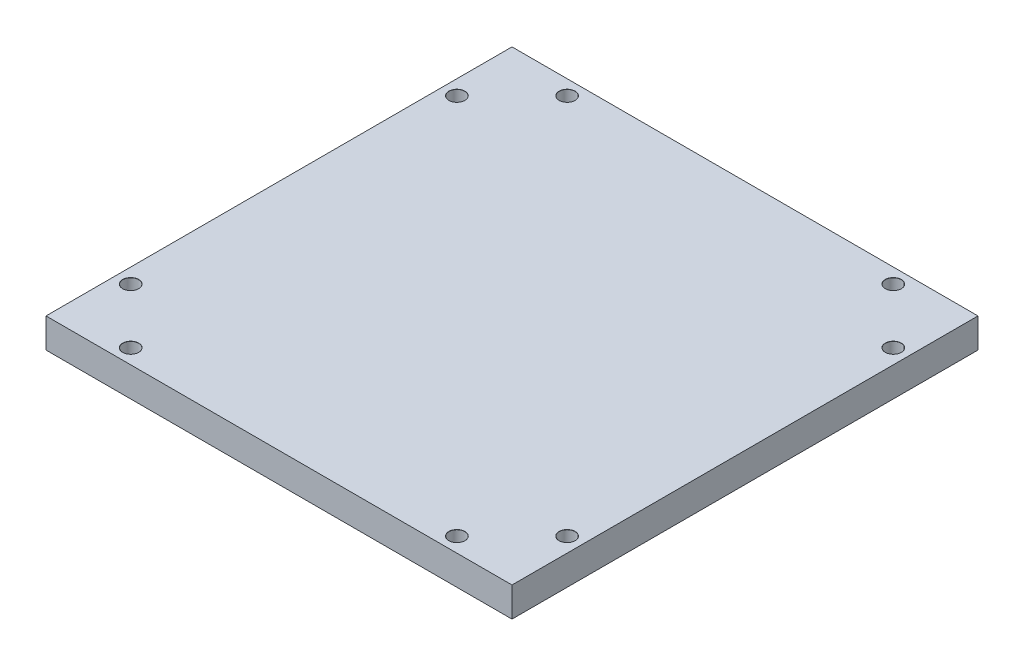
ISO-10303-21;
HEADER;
FILE_DESCRIPTION(('STEP AP214'),'2;1');
FILE_NAME('part.step','',(''),(''),'','','');
FILE_SCHEMA(('AUTOMOTIVE_DESIGN { 1 0 10303 214 1 1 1 1 }'));
ENDSEC;
DATA;
#1=APPLICATION_CONTEXT('core data for automotive mechanical design processes');
#2=APPLICATION_PROTOCOL_DEFINITION('international standard','automotive_design',2000,#1);
#3=PRODUCT_CONTEXT('',#1,'mechanical');
#4=PRODUCT('Part','Part','',(#3));
#5=PRODUCT_RELATED_PRODUCT_CATEGORY('part','',(#4));
#6=PRODUCT_DEFINITION_FORMATION('','',#4);
#7=PRODUCT_DEFINITION_CONTEXT('part definition',#1,'design');
#8=PRODUCT_DEFINITION('design','',#6,#7);
#9=PRODUCT_DEFINITION_SHAPE('','',#8);
#10=(LENGTH_UNIT() NAMED_UNIT(*) SI_UNIT(.MILLI.,.METRE.));
#11=(NAMED_UNIT(*) PLANE_ANGLE_UNIT() SI_UNIT($,.RADIAN.));
#12=(NAMED_UNIT(*) SI_UNIT($,.STERADIAN.) SOLID_ANGLE_UNIT());
#13=UNCERTAINTY_MEASURE_WITH_UNIT(LENGTH_MEASURE(1.E-05),#10,'distance_accuracy_value','');
#14=(GEOMETRIC_REPRESENTATION_CONTEXT(3) GLOBAL_UNCERTAINTY_ASSIGNED_CONTEXT((#13)) GLOBAL_UNIT_ASSIGNED_CONTEXT((#10,
#11,#12)) REPRESENTATION_CONTEXT('',''));
#15=CARTESIAN_POINT('',(0.,0.,0.));
#16=DIRECTION('',(0.,0.,1.));
#17=DIRECTION('',(1.,0.,0.));
#18=AXIS2_PLACEMENT_3D('',#15,#16,#17);
#19=CARTESIAN_POINT('',(0.,6.35,50.));
#20=DIRECTION('',(0.,0.,-1.));
#21=DIRECTION('',(-1.,0.,0.));
#22=AXIS2_PLACEMENT_3D('',#19,#20,#21);
#23=PLANE('',#22);
#24=DIRECTION('',(1.,0.,0.));
#25=VECTOR('',#24,1.);
#26=CARTESIAN_POINT('',(0.,0.,50.));
#27=LINE('',#26,#25);
#28=CARTESIAN_POINT('',(-50.,0.,50.));
#29=VERTEX_POINT('',#28);
#30=CARTESIAN_POINT('',(50.,0.,50.));
#31=VERTEX_POINT('',#30);
#32=EDGE_CURVE('E109',#29,#31,#27,.T.);
#33=ORIENTED_EDGE('',*,*,#32,.T.);
#34=DIRECTION('',(0.,-1.,0.));
#35=VECTOR('',#34,1.);
#36=CARTESIAN_POINT('',(50.,6.35,50.));
#37=LINE('',#36,#35);
#38=CARTESIAN_POINT('',(50.,6.35,50.));
#39=VERTEX_POINT('',#38);
#40=EDGE_CURVE('E11',#39,#31,#37,.T.);
#41=ORIENTED_EDGE('',*,*,#40,.F.);
#42=DIRECTION('',(1.,0.,0.));
#43=VECTOR('',#42,1.);
#44=CARTESIAN_POINT('',(0.,6.35,50.));
#45=LINE('',#44,#43);
#46=CARTESIAN_POINT('',(-50.,6.35,50.));
#47=VERTEX_POINT('',#46);
#48=EDGE_CURVE('E91',#47,#39,#45,.T.);
#49=ORIENTED_EDGE('',*,*,#48,.F.);
#50=DIRECTION('',(0.,-1.,0.));
#51=VECTOR('',#50,1.);
#52=CARTESIAN_POINT('',(-50.,6.35,50.));
#53=LINE('',#52,#51);
#54=EDGE_CURVE('E58',#47,#29,#53,.T.);
#55=ORIENTED_EDGE('',*,*,#54,.T.);
#56=EDGE_LOOP('',(#33,#41,#49,#55));
#57=FACE_BOUND('',#56,.T.);
#58=ADVANCED_FACE('F41',(#57),#23,.F.);
#59=CARTESIAN_POINT('',(50.,6.35,0.));
#60=DIRECTION('',(-1.,0.,0.));
#61=DIRECTION('',(0.,0.,1.));
#62=AXIS2_PLACEMENT_3D('',#59,#60,#61);
#63=PLANE('',#62);
#64=DIRECTION('',(0.,0.,-1.));
#65=VECTOR('',#64,1.);
#66=CARTESIAN_POINT('',(50.,0.,0.));
#67=LINE('',#66,#65);
#68=CARTESIAN_POINT('',(50.,0.,-50.));
#69=VERTEX_POINT('',#68);
#70=EDGE_CURVE('E97',#31,#69,#67,.T.);
#71=ORIENTED_EDGE('',*,*,#70,.T.);
#72=DIRECTION('',(0.,-1.,0.));
#73=VECTOR('',#72,1.);
#74=CARTESIAN_POINT('',(50.,6.35,-50.));
#75=LINE('',#74,#73);
#76=CARTESIAN_POINT('',(50.,6.35,-50.));
#77=VERTEX_POINT('',#76);
#78=EDGE_CURVE('E50',#77,#69,#75,.T.);
#79=ORIENTED_EDGE('',*,*,#78,.F.);
#80=DIRECTION('',(0.,0.,-1.));
#81=VECTOR('',#80,1.);
#82=CARTESIAN_POINT('',(50.,6.35,0.));
#83=LINE('',#82,#81);
#84=EDGE_CURVE('E83',#39,#77,#83,.T.);
#85=ORIENTED_EDGE('',*,*,#84,.F.);
#86=ORIENTED_EDGE('',*,*,#40,.T.);
#87=EDGE_LOOP('',(#71,#79,#85,#86));
#88=FACE_BOUND('',#87,.T.);
#89=ADVANCED_FACE('F96',(#88),#63,.F.);
#90=CARTESIAN_POINT('',(0.,6.35,-50.));
#91=DIRECTION('',(0.,0.,-1.));
#92=DIRECTION('',(-1.,0.,0.));
#93=AXIS2_PLACEMENT_3D('',#90,#91,#92);
#94=PLANE('',#93);
#95=DIRECTION('',(1.,0.,0.));
#96=VECTOR('',#95,1.);
#97=CARTESIAN_POINT('',(0.,0.,-50.));
#98=LINE('',#97,#96);
#99=CARTESIAN_POINT('',(-50.,0.,-50.));
#100=VERTEX_POINT('',#99);
#101=EDGE_CURVE('E115',#100,#69,#98,.T.);
#102=ORIENTED_EDGE('',*,*,#101,.F.);
#103=DIRECTION('',(0.,-1.,0.));
#104=VECTOR('',#103,1.);
#105=CARTESIAN_POINT('',(-50.,6.35,-50.));
#106=LINE('',#105,#104);
#107=CARTESIAN_POINT('',(-50.,6.35,-50.));
#108=VERTEX_POINT('',#107);
#109=EDGE_CURVE('E72',#108,#100,#106,.T.);
#110=ORIENTED_EDGE('',*,*,#109,.F.);
#111=DIRECTION('',(1.,0.,0.));
#112=VECTOR('',#111,1.);
#113=CARTESIAN_POINT('',(0.,6.35,-50.));
#114=LINE('',#113,#112);
#115=EDGE_CURVE('E90',#108,#77,#114,.T.);
#116=ORIENTED_EDGE('',*,*,#115,.T.);
#117=ORIENTED_EDGE('',*,*,#78,.T.);
#118=EDGE_LOOP('',(#102,#110,#116,#117));
#119=FACE_BOUND('',#118,.T.);
#120=ADVANCED_FACE('F101',(#119),#94,.T.);
#121=CARTESIAN_POINT('',(-50.,6.35,0.));
#122=DIRECTION('',(-1.,0.,0.));
#123=DIRECTION('',(0.,0.,1.));
#124=AXIS2_PLACEMENT_3D('',#121,#122,#123);
#125=PLANE('',#124);
#126=DIRECTION('',(0.,0.,-1.));
#127=VECTOR('',#126,1.);
#128=CARTESIAN_POINT('',(-50.,0.,0.));
#129=LINE('',#128,#127);
#130=EDGE_CURVE('E118',#29,#100,#129,.T.);
#131=ORIENTED_EDGE('',*,*,#130,.F.);
#132=ORIENTED_EDGE('',*,*,#54,.F.);
#133=DIRECTION('',(0.,0.,-1.));
#134=VECTOR('',#133,1.);
#135=CARTESIAN_POINT('',(-50.,6.35,0.));
#136=LINE('',#135,#134);
#137=EDGE_CURVE('E103',#47,#108,#136,.T.);
#138=ORIENTED_EDGE('',*,*,#137,.T.);
#139=ORIENTED_EDGE('',*,*,#109,.T.);
#140=EDGE_LOOP('',(#131,#132,#138,#139));
#141=FACE_BOUND('',#140,.T.);
#142=ADVANCED_FACE('F229',(#141),#125,.T.);
#143=CARTESIAN_POINT('',(0.,6.35,0.));
#144=DIRECTION('',(0.,1.,0.));
#145=DIRECTION('',(0.,0.,1.));
#146=AXIS2_PLACEMENT_3D('',#143,#144,#145);
#147=PLANE('',#146);
#148=CARTESIAN_POINT('',(-46.825,6.35,-35.));
#149=DIRECTION('',(0.,1.,0.));
#150=DIRECTION('',(0.,0.,1.));
#151=AXIS2_PLACEMENT_3D('',#148,#149,#150);
#152=CIRCLE('',#151,1.725);
#153=CARTESIAN_POINT('',(-46.825,6.35,-33.275));
#154=VERTEX_POINT('',#153);
#155=EDGE_CURVE('E219',#154,#154,#152,.T.);
#156=ORIENTED_EDGE('',*,*,#155,.F.);
#157=EDGE_LOOP('',(#156));
#158=FACE_BOUND('',#157,.T.);
#159=CARTESIAN_POINT('',(-35.,6.35,-46.825));
#160=DIRECTION('',(0.,1.,0.));
#161=DIRECTION('',(0.,0.,1.));
#162=AXIS2_PLACEMENT_3D('',#159,#160,#161);
#163=CIRCLE('',#162,1.725);
#164=CARTESIAN_POINT('',(-35.,6.35,-45.1));
#165=VERTEX_POINT('',#164);
#166=EDGE_CURVE('E207',#165,#165,#163,.T.);
#167=ORIENTED_EDGE('',*,*,#166,.F.);
#168=EDGE_LOOP('',(#167));
#169=FACE_BOUND('',#168,.T.);
#170=CARTESIAN_POINT('',(35.,6.35,-46.825));
#171=DIRECTION('',(0.,1.,0.));
#172=DIRECTION('',(0.,0.,1.));
#173=AXIS2_PLACEMENT_3D('',#170,#171,#172);
#174=CIRCLE('',#173,1.725);
#175=CARTESIAN_POINT('',(35.,6.35,-45.1));
#176=VERTEX_POINT('',#175);
#177=EDGE_CURVE('E195',#176,#176,#174,.T.);
#178=ORIENTED_EDGE('',*,*,#177,.F.);
#179=EDGE_LOOP('',(#178));
#180=FACE_BOUND('',#179,.T.);
#181=CARTESIAN_POINT('',(46.825,6.35,-35.));
#182=DIRECTION('',(0.,1.,0.));
#183=DIRECTION('',(0.,0.,1.));
#184=AXIS2_PLACEMENT_3D('',#181,#182,#183);
#185=CIRCLE('',#184,1.725);
#186=CARTESIAN_POINT('',(46.825,6.35,-33.275));
#187=VERTEX_POINT('',#186);
#188=EDGE_CURVE('E183',#187,#187,#185,.T.);
#189=ORIENTED_EDGE('',*,*,#188,.F.);
#190=EDGE_LOOP('',(#189));
#191=FACE_BOUND('',#190,.T.);
#192=CARTESIAN_POINT('',(46.825,6.35,35.));
#193=DIRECTION('',(0.,1.,0.));
#194=DIRECTION('',(0.,0.,1.));
#195=AXIS2_PLACEMENT_3D('',#192,#193,#194);
#196=CIRCLE('',#195,1.725);
#197=CARTESIAN_POINT('',(46.825,6.35,36.725));
#198=VERTEX_POINT('',#197);
#199=EDGE_CURVE('E171',#198,#198,#196,.T.);
#200=ORIENTED_EDGE('',*,*,#199,.F.);
#201=EDGE_LOOP('',(#200));
#202=FACE_BOUND('',#201,.T.);
#203=CARTESIAN_POINT('',(35.,6.35,46.825));
#204=DIRECTION('',(0.,1.,0.));
#205=DIRECTION('',(0.,0.,1.));
#206=AXIS2_PLACEMENT_3D('',#203,#204,#205);
#207=CIRCLE('',#206,1.725);
#208=CARTESIAN_POINT('',(35.,6.35,48.55));
#209=VERTEX_POINT('',#208);
#210=EDGE_CURVE('E159',#209,#209,#207,.T.);
#211=ORIENTED_EDGE('',*,*,#210,.F.);
#212=EDGE_LOOP('',(#211));
#213=FACE_BOUND('',#212,.T.);
#214=CARTESIAN_POINT('',(-35.,6.35,46.825));
#215=DIRECTION('',(0.,1.,0.));
#216=DIRECTION('',(0.,0.,1.));
#217=AXIS2_PLACEMENT_3D('',#214,#215,#216);
#218=CIRCLE('',#217,1.725);
#219=CARTESIAN_POINT('',(-35.,6.35,48.55));
#220=VERTEX_POINT('',#219);
#221=EDGE_CURVE('E147',#220,#220,#218,.T.);
#222=ORIENTED_EDGE('',*,*,#221,.F.);
#223=EDGE_LOOP('',(#222));
#224=FACE_BOUND('',#223,.T.);
#225=CARTESIAN_POINT('',(-46.825,6.35,35.));
#226=DIRECTION('',(0.,1.,0.));
#227=DIRECTION('',(0.,0.,1.));
#228=AXIS2_PLACEMENT_3D('',#225,#226,#227);
#229=CIRCLE('',#228,1.725);
#230=CARTESIAN_POINT('',(-46.825,6.35,36.725));
#231=VERTEX_POINT('',#230);
#232=EDGE_CURVE('E135',#231,#231,#229,.T.);
#233=ORIENTED_EDGE('',*,*,#232,.F.);
#234=EDGE_LOOP('',(#233));
#235=FACE_BOUND('',#234,.T.);
#236=ORIENTED_EDGE('',*,*,#48,.T.);
#237=ORIENTED_EDGE('',*,*,#84,.T.);
#238=ORIENTED_EDGE('',*,*,#115,.F.);
#239=ORIENTED_EDGE('',*,*,#137,.F.);
#240=EDGE_LOOP('',(#236,#237,#238,#239));
#241=FACE_BOUND('',#240,.T.);
#242=ADVANCED_FACE('F87',(#158,#169,#180,#191,#202,#213,#224,#235,#241),#147,.T.);
#243=CARTESIAN_POINT('',(0.,0.,0.));
#244=DIRECTION('',(0.,1.,0.));
#245=DIRECTION('',(0.,0.,1.));
#246=AXIS2_PLACEMENT_3D('',#243,#244,#245);
#247=PLANE('',#246);
#248=CARTESIAN_POINT('',(-46.825,0.,-35.));
#249=DIRECTION('',(0.,1.,0.));
#250=DIRECTION('',(0.,0.,1.));
#251=AXIS2_PLACEMENT_3D('',#248,#249,#250);
#252=CIRCLE('',#251,1.7);
#253=CARTESIAN_POINT('',(-46.825,0.,-33.3));
#254=VERTEX_POINT('',#253);
#255=EDGE_CURVE('E211',#254,#254,#252,.T.);
#256=ORIENTED_EDGE('',*,*,#255,.T.);
#257=EDGE_LOOP('',(#256));
#258=FACE_BOUND('',#257,.T.);
#259=CARTESIAN_POINT('',(-35.,0.,-46.825));
#260=DIRECTION('',(0.,1.,0.));
#261=DIRECTION('',(0.,0.,1.));
#262=AXIS2_PLACEMENT_3D('',#259,#260,#261);
#263=CIRCLE('',#262,1.7);
#264=CARTESIAN_POINT('',(-35.,0.,-45.125));
#265=VERTEX_POINT('',#264);
#266=EDGE_CURVE('E199',#265,#265,#263,.T.);
#267=ORIENTED_EDGE('',*,*,#266,.T.);
#268=EDGE_LOOP('',(#267));
#269=FACE_BOUND('',#268,.T.);
#270=CARTESIAN_POINT('',(35.,0.,-46.825));
#271=DIRECTION('',(0.,1.,0.));
#272=DIRECTION('',(0.,0.,1.));
#273=AXIS2_PLACEMENT_3D('',#270,#271,#272);
#274=CIRCLE('',#273,1.7);
#275=CARTESIAN_POINT('',(35.,0.,-45.125));
#276=VERTEX_POINT('',#275);
#277=EDGE_CURVE('E187',#276,#276,#274,.T.);
#278=ORIENTED_EDGE('',*,*,#277,.T.);
#279=EDGE_LOOP('',(#278));
#280=FACE_BOUND('',#279,.T.);
#281=CARTESIAN_POINT('',(46.825,0.,-35.));
#282=DIRECTION('',(0.,1.,0.));
#283=DIRECTION('',(0.,0.,1.));
#284=AXIS2_PLACEMENT_3D('',#281,#282,#283);
#285=CIRCLE('',#284,1.7);
#286=CARTESIAN_POINT('',(46.825,0.,-33.3));
#287=VERTEX_POINT('',#286);
#288=EDGE_CURVE('E175',#287,#287,#285,.T.);
#289=ORIENTED_EDGE('',*,*,#288,.T.);
#290=EDGE_LOOP('',(#289));
#291=FACE_BOUND('',#290,.T.);
#292=CARTESIAN_POINT('',(46.825,0.,35.));
#293=DIRECTION('',(0.,1.,0.));
#294=DIRECTION('',(0.,0.,1.));
#295=AXIS2_PLACEMENT_3D('',#292,#293,#294);
#296=CIRCLE('',#295,1.7);
#297=CARTESIAN_POINT('',(46.825,0.,36.7));
#298=VERTEX_POINT('',#297);
#299=EDGE_CURVE('E163',#298,#298,#296,.T.);
#300=ORIENTED_EDGE('',*,*,#299,.T.);
#301=EDGE_LOOP('',(#300));
#302=FACE_BOUND('',#301,.T.);
#303=CARTESIAN_POINT('',(35.,0.,46.825));
#304=DIRECTION('',(0.,1.,0.));
#305=DIRECTION('',(0.,0.,1.));
#306=AXIS2_PLACEMENT_3D('',#303,#304,#305);
#307=CIRCLE('',#306,1.7);
#308=CARTESIAN_POINT('',(35.,0.,48.525));
#309=VERTEX_POINT('',#308);
#310=EDGE_CURVE('E151',#309,#309,#307,.T.);
#311=ORIENTED_EDGE('',*,*,#310,.T.);
#312=EDGE_LOOP('',(#311));
#313=FACE_BOUND('',#312,.T.);
#314=CARTESIAN_POINT('',(-35.,0.,46.825));
#315=DIRECTION('',(0.,1.,0.));
#316=DIRECTION('',(0.,0.,1.));
#317=AXIS2_PLACEMENT_3D('',#314,#315,#316);
#318=CIRCLE('',#317,1.7);
#319=CARTESIAN_POINT('',(-35.,0.,48.525));
#320=VERTEX_POINT('',#319);
#321=EDGE_CURVE('E139',#320,#320,#318,.T.);
#322=ORIENTED_EDGE('',*,*,#321,.T.);
#323=EDGE_LOOP('',(#322));
#324=FACE_BOUND('',#323,.T.);
#325=CARTESIAN_POINT('',(-46.825,0.,35.));
#326=DIRECTION('',(0.,1.,0.));
#327=DIRECTION('',(0.,0.,1.));
#328=AXIS2_PLACEMENT_3D('',#325,#326,#327);
#329=CIRCLE('',#328,1.7);
#330=CARTESIAN_POINT('',(-46.825,0.,36.7));
#331=VERTEX_POINT('',#330);
#332=EDGE_CURVE('E112',#331,#331,#329,.T.);
#333=ORIENTED_EDGE('',*,*,#332,.T.);
#334=EDGE_LOOP('',(#333));
#335=FACE_BOUND('',#334,.T.);
#336=ORIENTED_EDGE('',*,*,#32,.F.);
#337=ORIENTED_EDGE('',*,*,#130,.T.);
#338=ORIENTED_EDGE('',*,*,#101,.T.);
#339=ORIENTED_EDGE('',*,*,#70,.F.);
#340=EDGE_LOOP('',(#336,#337,#338,#339));
#341=FACE_BOUND('',#340,.T.);
#342=ADVANCED_FACE('F228',(#258,#269,#280,#291,#302,#313,#324,#335,#341),#247,.F.);
#343=CARTESIAN_POINT('',(-46.825,6.35,35.));
#344=DIRECTION('',(0.,1.,0.));
#345=DIRECTION('',(0.,0.,1.));
#346=AXIS2_PLACEMENT_3D('',#343,#344,#345);
#347=CYLINDRICAL_SURFACE('',#346,1.7);
#348=ORIENTED_EDGE('',*,*,#332,.F.);
#349=EDGE_LOOP('',(#348));
#350=FACE_BOUND('',#349,.T.);
#351=CARTESIAN_POINT('',(-46.825,6.325,35.));
#352=DIRECTION('',(0.,1.,0.));
#353=DIRECTION('',(0.,0.,1.));
#354=AXIS2_PLACEMENT_3D('',#351,#352,#353);
#355=CIRCLE('',#354,1.7);
#356=CARTESIAN_POINT('',(-46.825,6.325,36.7));
#357=VERTEX_POINT('',#356);
#358=EDGE_CURVE('E131',#357,#357,#355,.T.);
#359=ORIENTED_EDGE('',*,*,#358,.T.);
#360=EDGE_LOOP('',(#359));
#361=FACE_BOUND('',#360,.T.);
#362=ADVANCED_FACE('F248',(#350,#361),#347,.F.);
#363=CARTESIAN_POINT('',(-46.825,6.35,35.));
#364=DIRECTION('',(0.,1.,0.));
#365=DIRECTION('',(0.,0.,1.));
#366=AXIS2_PLACEMENT_3D('',#363,#364,#365);
#367=CONICAL_SURFACE('',#366,1.725,0.785398163397362);
#368=ORIENTED_EDGE('',*,*,#358,.F.);
#369=EDGE_LOOP('',(#368));
#370=FACE_BOUND('',#369,.T.);
#371=ORIENTED_EDGE('',*,*,#232,.T.);
#372=EDGE_LOOP('',(#371));
#373=FACE_BOUND('',#372,.T.);
#374=ADVANCED_FACE('F245',(#370,#373),#367,.F.);
#375=CARTESIAN_POINT('',(-35.,6.35,46.825));
#376=DIRECTION('',(0.,1.,0.));
#377=DIRECTION('',(0.,0.,1.));
#378=AXIS2_PLACEMENT_3D('',#375,#376,#377);
#379=CYLINDRICAL_SURFACE('',#378,1.7);
#380=ORIENTED_EDGE('',*,*,#321,.F.);
#381=EDGE_LOOP('',(#380));
#382=FACE_BOUND('',#381,.T.);
#383=CARTESIAN_POINT('',(-35.,6.325,46.825));
#384=DIRECTION('',(0.,1.,0.));
#385=DIRECTION('',(0.,0.,1.));
#386=AXIS2_PLACEMENT_3D('',#383,#384,#385);
#387=CIRCLE('',#386,1.7);
#388=CARTESIAN_POINT('',(-35.,6.325,48.525));
#389=VERTEX_POINT('',#388);
#390=EDGE_CURVE('E143',#389,#389,#387,.T.);
#391=ORIENTED_EDGE('',*,*,#390,.T.);
#392=EDGE_LOOP('',(#391));
#393=FACE_BOUND('',#392,.T.);
#394=ADVANCED_FACE('F247',(#382,#393),#379,.F.);
#395=CARTESIAN_POINT('',(-35.,6.35,46.825));
#396=DIRECTION('',(0.,1.,0.));
#397=DIRECTION('',(0.,0.,1.));
#398=AXIS2_PLACEMENT_3D('',#395,#396,#397);
#399=CONICAL_SURFACE('',#398,1.725,0.785398163397362);
#400=ORIENTED_EDGE('',*,*,#390,.F.);
#401=EDGE_LOOP('',(#400));
#402=FACE_BOUND('',#401,.T.);
#403=ORIENTED_EDGE('',*,*,#221,.T.);
#404=EDGE_LOOP('',(#403));
#405=FACE_BOUND('',#404,.T.);
#406=ADVANCED_FACE('F255',(#402,#405),#399,.F.);
#407=CARTESIAN_POINT('',(35.,6.35,46.825));
#408=DIRECTION('',(0.,1.,0.));
#409=DIRECTION('',(0.,0.,1.));
#410=AXIS2_PLACEMENT_3D('',#407,#408,#409);
#411=CYLINDRICAL_SURFACE('',#410,1.7);
#412=ORIENTED_EDGE('',*,*,#310,.F.);
#413=EDGE_LOOP('',(#412));
#414=FACE_BOUND('',#413,.T.);
#415=CARTESIAN_POINT('',(35.,6.325,46.825));
#416=DIRECTION('',(0.,1.,0.));
#417=DIRECTION('',(0.,0.,1.));
#418=AXIS2_PLACEMENT_3D('',#415,#416,#417);
#419=CIRCLE('',#418,1.7);
#420=CARTESIAN_POINT('',(35.,6.325,48.525));
#421=VERTEX_POINT('',#420);
#422=EDGE_CURVE('E155',#421,#421,#419,.T.);
#423=ORIENTED_EDGE('',*,*,#422,.T.);
#424=EDGE_LOOP('',(#423));
#425=FACE_BOUND('',#424,.T.);
#426=ADVANCED_FACE('F297',(#414,#425),#411,.F.);
#427=CARTESIAN_POINT('',(35.,6.35,46.825));
#428=DIRECTION('',(0.,1.,0.));
#429=DIRECTION('',(0.,0.,1.));
#430=AXIS2_PLACEMENT_3D('',#427,#428,#429);
#431=CONICAL_SURFACE('',#430,1.725,0.785398163397362);
#432=ORIENTED_EDGE('',*,*,#422,.F.);
#433=EDGE_LOOP('',(#432));
#434=FACE_BOUND('',#433,.T.);
#435=ORIENTED_EDGE('',*,*,#210,.T.);
#436=EDGE_LOOP('',(#435));
#437=FACE_BOUND('',#436,.T.);
#438=ADVANCED_FACE('F302',(#434,#437),#431,.F.);
#439=CARTESIAN_POINT('',(46.825,6.35,35.));
#440=DIRECTION('',(0.,1.,0.));
#441=DIRECTION('',(0.,0.,1.));
#442=AXIS2_PLACEMENT_3D('',#439,#440,#441);
#443=CYLINDRICAL_SURFACE('',#442,1.7);
#444=ORIENTED_EDGE('',*,*,#299,.F.);
#445=EDGE_LOOP('',(#444));
#446=FACE_BOUND('',#445,.T.);
#447=CARTESIAN_POINT('',(46.825,6.325,35.));
#448=DIRECTION('',(0.,1.,0.));
#449=DIRECTION('',(0.,0.,1.));
#450=AXIS2_PLACEMENT_3D('',#447,#448,#449);
#451=CIRCLE('',#450,1.7);
#452=CARTESIAN_POINT('',(46.825,6.325,36.7));
#453=VERTEX_POINT('',#452);
#454=EDGE_CURVE('E167',#453,#453,#451,.T.);
#455=ORIENTED_EDGE('',*,*,#454,.T.);
#456=EDGE_LOOP('',(#455));
#457=FACE_BOUND('',#456,.T.);
#458=ADVANCED_FACE('F308',(#446,#457),#443,.F.);
#459=CARTESIAN_POINT('',(46.825,6.35,35.));
#460=DIRECTION('',(0.,1.,0.));
#461=DIRECTION('',(0.,0.,1.));
#462=AXIS2_PLACEMENT_3D('',#459,#460,#461);
#463=CONICAL_SURFACE('',#462,1.725,0.785398163397362);
#464=ORIENTED_EDGE('',*,*,#454,.F.);
#465=EDGE_LOOP('',(#464));
#466=FACE_BOUND('',#465,.T.);
#467=ORIENTED_EDGE('',*,*,#199,.T.);
#468=EDGE_LOOP('',(#467));
#469=FACE_BOUND('',#468,.T.);
#470=ADVANCED_FACE('F312',(#466,#469),#463,.F.);
#471=CARTESIAN_POINT('',(46.825,6.35,-35.));
#472=DIRECTION('',(0.,1.,0.));
#473=DIRECTION('',(0.,0.,1.));
#474=AXIS2_PLACEMENT_3D('',#471,#472,#473);
#475=CYLINDRICAL_SURFACE('',#474,1.7);
#476=ORIENTED_EDGE('',*,*,#288,.F.);
#477=EDGE_LOOP('',(#476));
#478=FACE_BOUND('',#477,.T.);
#479=CARTESIAN_POINT('',(46.825,6.325,-35.));
#480=DIRECTION('',(0.,1.,0.));
#481=DIRECTION('',(0.,0.,1.));
#482=AXIS2_PLACEMENT_3D('',#479,#480,#481);
#483=CIRCLE('',#482,1.7);
#484=CARTESIAN_POINT('',(46.825,6.325,-33.3));
#485=VERTEX_POINT('',#484);
#486=EDGE_CURVE('E179',#485,#485,#483,.T.);
#487=ORIENTED_EDGE('',*,*,#486,.T.);
#488=EDGE_LOOP('',(#487));
#489=FACE_BOUND('',#488,.T.);
#490=ADVANCED_FACE('F316',(#478,#489),#475,.F.);
#491=CARTESIAN_POINT('',(46.825,6.35,-35.));
#492=DIRECTION('',(0.,1.,0.));
#493=DIRECTION('',(0.,0.,1.));
#494=AXIS2_PLACEMENT_3D('',#491,#492,#493);
#495=CONICAL_SURFACE('',#494,1.725,0.785398163397362);
#496=ORIENTED_EDGE('',*,*,#486,.F.);
#497=EDGE_LOOP('',(#496));
#498=FACE_BOUND('',#497,.T.);
#499=ORIENTED_EDGE('',*,*,#188,.T.);
#500=EDGE_LOOP('',(#499));
#501=FACE_BOUND('',#500,.T.);
#502=ADVANCED_FACE('F320',(#498,#501),#495,.F.);
#503=CARTESIAN_POINT('',(35.,6.35,-46.825));
#504=DIRECTION('',(0.,1.,0.));
#505=DIRECTION('',(0.,0.,1.));
#506=AXIS2_PLACEMENT_3D('',#503,#504,#505);
#507=CYLINDRICAL_SURFACE('',#506,1.7);
#508=ORIENTED_EDGE('',*,*,#277,.F.);
#509=EDGE_LOOP('',(#508));
#510=FACE_BOUND('',#509,.T.);
#511=CARTESIAN_POINT('',(35.,6.325,-46.825));
#512=DIRECTION('',(0.,1.,0.));
#513=DIRECTION('',(0.,0.,1.));
#514=AXIS2_PLACEMENT_3D('',#511,#512,#513);
#515=CIRCLE('',#514,1.7);
#516=CARTESIAN_POINT('',(35.,6.325,-45.125));
#517=VERTEX_POINT('',#516);
#518=EDGE_CURVE('E191',#517,#517,#515,.T.);
#519=ORIENTED_EDGE('',*,*,#518,.T.);
#520=EDGE_LOOP('',(#519));
#521=FACE_BOUND('',#520,.T.);
#522=ADVANCED_FACE('F324',(#510,#521),#507,.F.);
#523=CARTESIAN_POINT('',(35.,6.35,-46.825));
#524=DIRECTION('',(0.,1.,0.));
#525=DIRECTION('',(0.,0.,1.));
#526=AXIS2_PLACEMENT_3D('',#523,#524,#525);
#527=CONICAL_SURFACE('',#526,1.725,0.785398163397362);
#528=ORIENTED_EDGE('',*,*,#518,.F.);
#529=EDGE_LOOP('',(#528));
#530=FACE_BOUND('',#529,.T.);
#531=ORIENTED_EDGE('',*,*,#177,.T.);
#532=EDGE_LOOP('',(#531));
#533=FACE_BOUND('',#532,.T.);
#534=ADVANCED_FACE('F328',(#530,#533),#527,.F.);
#535=CARTESIAN_POINT('',(-35.,6.35,-46.825));
#536=DIRECTION('',(0.,1.,0.));
#537=DIRECTION('',(0.,0.,1.));
#538=AXIS2_PLACEMENT_3D('',#535,#536,#537);
#539=CYLINDRICAL_SURFACE('',#538,1.7);
#540=ORIENTED_EDGE('',*,*,#266,.F.);
#541=EDGE_LOOP('',(#540));
#542=FACE_BOUND('',#541,.T.);
#543=CARTESIAN_POINT('',(-35.,6.325,-46.825));
#544=DIRECTION('',(0.,1.,0.));
#545=DIRECTION('',(0.,0.,1.));
#546=AXIS2_PLACEMENT_3D('',#543,#544,#545);
#547=CIRCLE('',#546,1.7);
#548=CARTESIAN_POINT('',(-35.,6.325,-45.125));
#549=VERTEX_POINT('',#548);
#550=EDGE_CURVE('E203',#549,#549,#547,.T.);
#551=ORIENTED_EDGE('',*,*,#550,.T.);
#552=EDGE_LOOP('',(#551));
#553=FACE_BOUND('',#552,.T.);
#554=ADVANCED_FACE('F332',(#542,#553),#539,.F.);
#555=CARTESIAN_POINT('',(-35.,6.35,-46.825));
#556=DIRECTION('',(0.,1.,0.));
#557=DIRECTION('',(0.,0.,1.));
#558=AXIS2_PLACEMENT_3D('',#555,#556,#557);
#559=CONICAL_SURFACE('',#558,1.725,0.785398163397362);
#560=ORIENTED_EDGE('',*,*,#550,.F.);
#561=EDGE_LOOP('',(#560));
#562=FACE_BOUND('',#561,.T.);
#563=ORIENTED_EDGE('',*,*,#166,.T.);
#564=EDGE_LOOP('',(#563));
#565=FACE_BOUND('',#564,.T.);
#566=ADVANCED_FACE('F336',(#562,#565),#559,.F.);
#567=CARTESIAN_POINT('',(-46.825,6.35,-35.));
#568=DIRECTION('',(0.,1.,0.));
#569=DIRECTION('',(0.,0.,1.));
#570=AXIS2_PLACEMENT_3D('',#567,#568,#569);
#571=CYLINDRICAL_SURFACE('',#570,1.7);
#572=ORIENTED_EDGE('',*,*,#255,.F.);
#573=EDGE_LOOP('',(#572));
#574=FACE_BOUND('',#573,.T.);
#575=CARTESIAN_POINT('',(-46.825,6.325,-35.));
#576=DIRECTION('',(0.,1.,0.));
#577=DIRECTION('',(0.,0.,1.));
#578=AXIS2_PLACEMENT_3D('',#575,#576,#577);
#579=CIRCLE('',#578,1.7);
#580=CARTESIAN_POINT('',(-46.825,6.325,-33.3));
#581=VERTEX_POINT('',#580);
#582=EDGE_CURVE('E215',#581,#581,#579,.T.);
#583=ORIENTED_EDGE('',*,*,#582,.T.);
#584=EDGE_LOOP('',(#583));
#585=FACE_BOUND('',#584,.T.);
#586=ADVANCED_FACE('F340',(#574,#585),#571,.F.);
#587=CARTESIAN_POINT('',(-46.825,6.35,-35.));
#588=DIRECTION('',(0.,1.,0.));
#589=DIRECTION('',(0.,0.,1.));
#590=AXIS2_PLACEMENT_3D('',#587,#588,#589);
#591=CONICAL_SURFACE('',#590,1.725,0.785398163397362);
#592=ORIENTED_EDGE('',*,*,#582,.F.);
#593=EDGE_LOOP('',(#592));
#594=FACE_BOUND('',#593,.T.);
#595=ORIENTED_EDGE('',*,*,#155,.T.);
#596=EDGE_LOOP('',(#595));
#597=FACE_BOUND('',#596,.T.);
#598=ADVANCED_FACE('F224',(#594,#597),#591,.F.);
#599=CLOSED_SHELL('',(#58,#89,#120,#142,#242,#342,#362,#374,#394,#406,#426,#438,#458,#470,#490,
#502,#522,#534,#554,#566,#586,#598));
#600=MANIFOLD_SOLID_BREP('B2',#599);
#601=ADVANCED_BREP_SHAPE_REPRESENTATION('',(#18,#600),#14);
#602=SHAPE_DEFINITION_REPRESENTATION(#9,#601);
ENDSEC;
END-ISO-10303-21;
